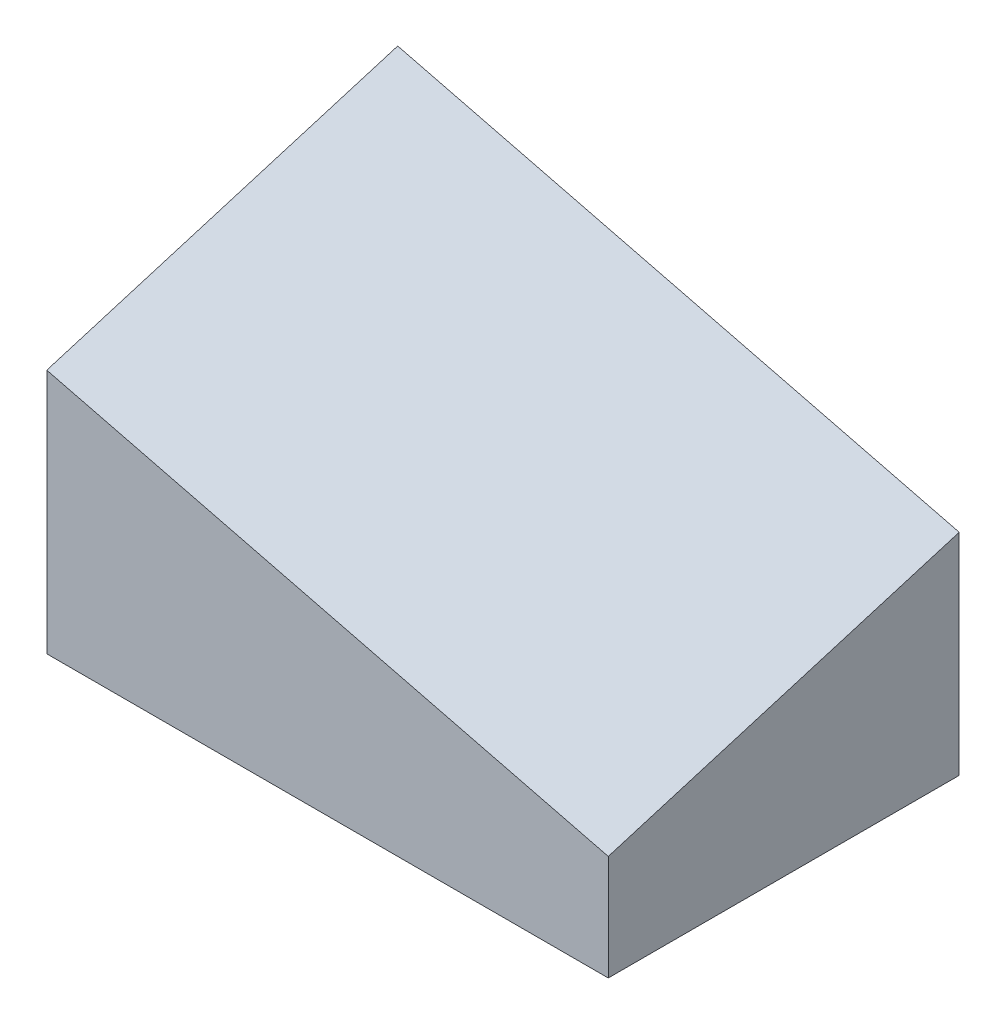
ISO-10303-21;
HEADER;
FILE_DESCRIPTION(('STEP AP214'),'2;1');
FILE_NAME('part.step','',(''),(''),'','','');
FILE_SCHEMA(('AUTOMOTIVE_DESIGN { 1 0 10303 214 1 1 1 1 }'));
ENDSEC;
DATA;
#1=APPLICATION_CONTEXT('core data for automotive mechanical design processes');
#2=APPLICATION_PROTOCOL_DEFINITION('international standard','automotive_design',2000,#1);
#3=PRODUCT_CONTEXT('',#1,'mechanical');
#4=PRODUCT('Part','Part','',(#3));
#5=PRODUCT_RELATED_PRODUCT_CATEGORY('part','',(#4));
#6=PRODUCT_DEFINITION_FORMATION('','',#4);
#7=PRODUCT_DEFINITION_CONTEXT('part definition',#1,'design');
#8=PRODUCT_DEFINITION('design','',#6,#7);
#9=PRODUCT_DEFINITION_SHAPE('','',#8);
#10=(LENGTH_UNIT() NAMED_UNIT(*) SI_UNIT(.MILLI.,.METRE.));
#11=(NAMED_UNIT(*) PLANE_ANGLE_UNIT() SI_UNIT($,.RADIAN.));
#12=(NAMED_UNIT(*) SI_UNIT($,.STERADIAN.) SOLID_ANGLE_UNIT());
#13=UNCERTAINTY_MEASURE_WITH_UNIT(LENGTH_MEASURE(1.E-05),#10,'distance_accuracy_value','');
#14=(GEOMETRIC_REPRESENTATION_CONTEXT(3) GLOBAL_UNCERTAINTY_ASSIGNED_CONTEXT((#13)) GLOBAL_UNIT_ASSIGNED_CONTEXT((#10,
#11,#12)) REPRESENTATION_CONTEXT('',''));
#15=CARTESIAN_POINT('',(0.,0.,0.));
#16=DIRECTION('',(0.,0.,1.));
#17=DIRECTION('',(1.,0.,0.));
#18=AXIS2_PLACEMENT_3D('',#15,#16,#17);
#19=CARTESIAN_POINT('',(2.,2.5,1.25));
#20=DIRECTION('',(-1.,0.,0.));
#21=DIRECTION('',(0.,0.,1.));
#22=AXIS2_PLACEMENT_3D('',#19,#20,#21);
#23=PLANE('',#22);
#24=DIRECTION('',(0.,0.287347885566345,-0.957826285221151));
#25=VECTOR('',#24,1.);
#26=CARTESIAN_POINT('',(2.,0.75,1.25));
#27=LINE('',#26,#25);
#28=CARTESIAN_POINT('',(2.,0.75,1.25));
#29=VERTEX_POINT('',#28);
#30=CARTESIAN_POINT('',(2.,1.5,-1.25));
#31=VERTEX_POINT('',#30);
#32=EDGE_CURVE('E122',#29,#31,#27,.T.);
#33=ORIENTED_EDGE('',*,*,#32,.F.);
#34=DIRECTION('',(0.,-1.,0.));
#35=VECTOR('',#34,1.);
#36=CARTESIAN_POINT('',(2.,2.5,1.25));
#37=LINE('',#36,#35);
#38=CARTESIAN_POINT('',(2.,0.,1.25));
#39=VERTEX_POINT('',#38);
#40=EDGE_CURVE('E103',#29,#39,#37,.T.);
#41=ORIENTED_EDGE('',*,*,#40,.T.);
#42=DIRECTION('',(0.,0.,-1.));
#43=VECTOR('',#42,1.);
#44=CARTESIAN_POINT('',(2.,0.,1.25));
#45=LINE('',#44,#43);
#46=CARTESIAN_POINT('',(2.,0.,-1.25));
#47=VERTEX_POINT('',#46);
#48=EDGE_CURVE('E127',#39,#47,#45,.T.);
#49=ORIENTED_EDGE('',*,*,#48,.T.);
#50=DIRECTION('',(0.,-1.,0.));
#51=VECTOR('',#50,1.);
#52=CARTESIAN_POINT('',(2.,2.5,-1.25));
#53=LINE('',#52,#51);
#54=EDGE_CURVE('E12',#31,#47,#53,.T.);
#55=ORIENTED_EDGE('',*,*,#54,.F.);
#56=EDGE_LOOP('',(#33,#41,#49,#55));
#57=FACE_BOUND('',#56,.T.);
#58=ADVANCED_FACE('F78',(#57),#23,.F.);
#59=CARTESIAN_POINT('',(-2.,2.5,-1.25));
#60=DIRECTION('',(0.,0.,1.));
#61=DIRECTION('',(1.,0.,0.));
#62=AXIS2_PLACEMENT_3D('',#59,#60,#61);
#63=PLANE('',#62);
#64=DIRECTION('',(-0.970142500145332,0.242535625036333,0.));
#65=VECTOR('',#64,1.);
#66=CARTESIAN_POINT('',(2.,1.5,-1.25));
#67=LINE('',#66,#65);
#68=CARTESIAN_POINT('',(-2.,2.5,-1.25));
#69=VERTEX_POINT('',#68);
#70=EDGE_CURVE('E120',#31,#69,#67,.T.);
#71=ORIENTED_EDGE('',*,*,#70,.F.);
#72=ORIENTED_EDGE('',*,*,#54,.T.);
#73=DIRECTION('',(-1.,0.,0.));
#74=VECTOR('',#73,1.);
#75=CARTESIAN_POINT('',(-2.,0.,-1.25));
#76=LINE('',#75,#74);
#77=CARTESIAN_POINT('',(-2.,0.,-1.25));
#78=VERTEX_POINT('',#77);
#79=EDGE_CURVE('E141',#47,#78,#76,.T.);
#80=ORIENTED_EDGE('',*,*,#79,.T.);
#81=DIRECTION('',(0.,-1.,0.));
#82=VECTOR('',#81,1.);
#83=CARTESIAN_POINT('',(-2.,2.5,-1.25));
#84=LINE('',#83,#82);
#85=EDGE_CURVE('E87',#69,#78,#84,.T.);
#86=ORIENTED_EDGE('',*,*,#85,.F.);
#87=EDGE_LOOP('',(#71,#72,#80,#86));
#88=FACE_BOUND('',#87,.T.);
#89=ADVANCED_FACE('F139',(#88),#63,.F.);
#90=CARTESIAN_POINT('',(-2.,2.5,1.25));
#91=DIRECTION('',(1.,0.,0.));
#92=DIRECTION('',(0.,0.,-1.));
#93=AXIS2_PLACEMENT_3D('',#90,#91,#92);
#94=PLANE('',#93);
#95=DIRECTION('',(0.,-0.287347885566345,0.957826285221151));
#96=VECTOR('',#95,1.);
#97=CARTESIAN_POINT('',(-2.,2.5,-1.25));
#98=LINE('',#97,#96);
#99=CARTESIAN_POINT('',(-2.,1.75,1.25));
#100=VERTEX_POINT('',#99);
#101=EDGE_CURVE('E95',#69,#100,#98,.T.);
#102=ORIENTED_EDGE('',*,*,#101,.F.);
#103=ORIENTED_EDGE('',*,*,#85,.T.);
#104=DIRECTION('',(0.,0.,1.));
#105=VECTOR('',#104,1.);
#106=CARTESIAN_POINT('',(-2.,0.,1.25));
#107=LINE('',#106,#105);
#108=CARTESIAN_POINT('',(-2.,0.,1.25));
#109=VERTEX_POINT('',#108);
#110=EDGE_CURVE('E157',#78,#109,#107,.T.);
#111=ORIENTED_EDGE('',*,*,#110,.T.);
#112=DIRECTION('',(0.,-1.,0.));
#113=VECTOR('',#112,1.);
#114=CARTESIAN_POINT('',(-2.,2.5,1.25));
#115=LINE('',#114,#113);
#116=EDGE_CURVE('E135',#100,#109,#115,.T.);
#117=ORIENTED_EDGE('',*,*,#116,.F.);
#118=EDGE_LOOP('',(#102,#103,#111,#117));
#119=FACE_BOUND('',#118,.T.);
#120=ADVANCED_FACE('F132',(#119),#94,.F.);
#121=CARTESIAN_POINT('',(-2.,2.5,1.25));
#122=DIRECTION('',(0.,0.,-1.));
#123=DIRECTION('',(-1.,0.,0.));
#124=AXIS2_PLACEMENT_3D('',#121,#122,#123);
#125=PLANE('',#124);
#126=DIRECTION('',(0.970142500145332,-0.242535625036333,0.));
#127=VECTOR('',#126,1.);
#128=CARTESIAN_POINT('',(-2.,1.75,1.25));
#129=LINE('',#128,#127);
#130=EDGE_CURVE('E137',#100,#29,#129,.T.);
#131=ORIENTED_EDGE('',*,*,#130,.F.);
#132=ORIENTED_EDGE('',*,*,#116,.T.);
#133=DIRECTION('',(1.,0.,0.));
#134=VECTOR('',#133,1.);
#135=CARTESIAN_POINT('',(-2.,0.,1.25));
#136=LINE('',#135,#134);
#137=EDGE_CURVE('E152',#109,#39,#136,.T.);
#138=ORIENTED_EDGE('',*,*,#137,.T.);
#139=ORIENTED_EDGE('',*,*,#40,.F.);
#140=EDGE_LOOP('',(#131,#132,#138,#139));
#141=FACE_BOUND('',#140,.T.);
#142=ADVANCED_FACE('F176',(#141),#125,.F.);
#143=CARTESIAN_POINT('',(0.,0.,0.));
#144=DIRECTION('',(0.,-1.,0.));
#145=DIRECTION('',(0.,0.,-1.));
#146=AXIS2_PLACEMENT_3D('',#143,#144,#145);
#147=PLANE('',#146);
#148=ORIENTED_EDGE('',*,*,#48,.F.);
#149=ORIENTED_EDGE('',*,*,#137,.F.);
#150=ORIENTED_EDGE('',*,*,#110,.F.);
#151=ORIENTED_EDGE('',*,*,#79,.F.);
#152=EDGE_LOOP('',(#148,#149,#150,#151));
#153=FACE_BOUND('',#152,.T.);
#154=ADVANCED_FACE('F180',(#153),#147,.T.);
#155=CARTESIAN_POINT('',(0.352494577006508,1.40997830802603,0.422993492407809));
#156=DIRECTION('',(0.232873216416311,0.931492865665245,0.279447859699573));
#157=DIRECTION('',(0.,-0.287347885566345,0.957826285221152));
#158=AXIS2_PLACEMENT_3D('',#155,#156,#157);
#159=PLANE('',#158);
#160=ORIENTED_EDGE('',*,*,#32,.T.);
#161=ORIENTED_EDGE('',*,*,#70,.T.);
#162=ORIENTED_EDGE('',*,*,#101,.T.);
#163=ORIENTED_EDGE('',*,*,#130,.T.);
#164=EDGE_LOOP('',(#160,#161,#162,#163));
#165=FACE_BOUND('',#164,.T.);
#166=ADVANCED_FACE('F121',(#165),#159,.T.);
#167=CLOSED_SHELL('',(#58,#89,#120,#142,#154,#166));
#168=MANIFOLD_SOLID_BREP('B2',#167);
#169=ADVANCED_BREP_SHAPE_REPRESENTATION('',(#18,#168),#14);
#170=SHAPE_DEFINITION_REPRESENTATION(#9,#169);
ENDSEC;
END-ISO-10303-21;
